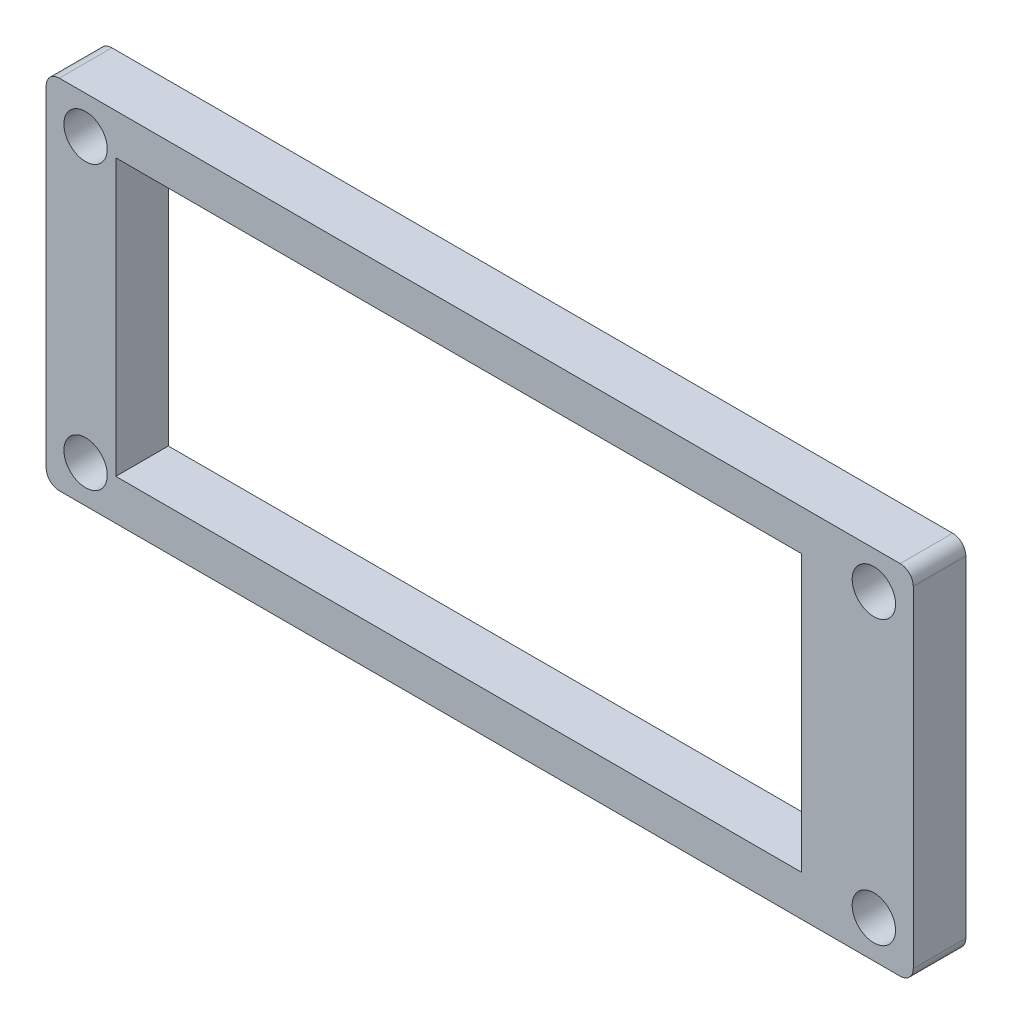
ISO-10303-21;
HEADER;
FILE_DESCRIPTION(('STEP AP214'),'2;1');
FILE_NAME('part.step','',(''),(''),'','','');
FILE_SCHEMA(('AUTOMOTIVE_DESIGN { 1 0 10303 214 1 1 1 1 }'));
ENDSEC;
DATA;
#1=APPLICATION_CONTEXT('core data for automotive mechanical design processes');
#2=APPLICATION_PROTOCOL_DEFINITION('international standard','automotive_design',2000,#1);
#3=PRODUCT_CONTEXT('',#1,'mechanical');
#4=PRODUCT('Part','Part','',(#3));
#5=PRODUCT_RELATED_PRODUCT_CATEGORY('part','',(#4));
#6=PRODUCT_DEFINITION_FORMATION('','',#4);
#7=PRODUCT_DEFINITION_CONTEXT('part definition',#1,'design');
#8=PRODUCT_DEFINITION('design','',#6,#7);
#9=PRODUCT_DEFINITION_SHAPE('','',#8);
#10=(LENGTH_UNIT() NAMED_UNIT(*) SI_UNIT(.MILLI.,.METRE.));
#11=(NAMED_UNIT(*) PLANE_ANGLE_UNIT() SI_UNIT($,.RADIAN.));
#12=(NAMED_UNIT(*) SI_UNIT($,.STERADIAN.) SOLID_ANGLE_UNIT());
#13=UNCERTAINTY_MEASURE_WITH_UNIT(LENGTH_MEASURE(1.E-05),#10,'distance_accuracy_value','');
#14=(GEOMETRIC_REPRESENTATION_CONTEXT(3) GLOBAL_UNCERTAINTY_ASSIGNED_CONTEXT((#13)) GLOBAL_UNIT_ASSIGNED_CONTEXT((#10,
#11,#12)) REPRESENTATION_CONTEXT('',''));
#15=CARTESIAN_POINT('',(0.,0.,0.));
#16=DIRECTION('',(0.,0.,1.));
#17=DIRECTION('',(1.,0.,0.));
#18=AXIS2_PLACEMENT_3D('',#15,#16,#17);
#19=CARTESIAN_POINT('',(34.6,0.,79.3851525178731));
#20=DIRECTION('',(1.,0.,0.));
#21=DIRECTION('',(0.,0.,-1.));
#22=AXIS2_PLACEMENT_3D('',#19,#20,#21);
#23=PLANE('',#22);
#24=DIRECTION('',(0.,0.,-1.));
#25=VECTOR('',#24,1.);
#26=CARTESIAN_POINT('',(34.6,12.6,79.3851525178731));
#27=LINE('',#26,#25);
#28=CARTESIAN_POINT('',(34.6,12.6,4.));
#29=VERTEX_POINT('',#28);
#30=CARTESIAN_POINT('',(34.6,12.6,0.));
#31=VERTEX_POINT('',#30);
#32=EDGE_CURVE('E279',#29,#31,#27,.T.);
#33=ORIENTED_EDGE('',*,*,#32,.F.);
#34=DIRECTION('',(0.,-1.,0.));
#35=VECTOR('',#34,1.);
#36=CARTESIAN_POINT('',(34.6,0.,4.));
#37=LINE('',#36,#35);
#38=CARTESIAN_POINT('',(34.6,-12.6,4.));
#39=VERTEX_POINT('',#38);
#40=EDGE_CURVE('E188',#29,#39,#37,.T.);
#41=ORIENTED_EDGE('',*,*,#40,.T.);
#42=DIRECTION('',(0.,0.,-1.));
#43=VECTOR('',#42,1.);
#44=CARTESIAN_POINT('',(34.6,-12.6,79.3851525178731));
#45=LINE('',#44,#43);
#46=CARTESIAN_POINT('',(34.6,-12.6,0.));
#47=VERTEX_POINT('',#46);
#48=EDGE_CURVE('E343',#39,#47,#45,.T.);
#49=ORIENTED_EDGE('',*,*,#48,.T.);
#50=DIRECTION('',(0.,-1.,0.));
#51=VECTOR('',#50,1.);
#52=CARTESIAN_POINT('',(34.6,0.,0.));
#53=LINE('',#52,#51);
#54=EDGE_CURVE('E258',#31,#47,#53,.T.);
#55=ORIENTED_EDGE('',*,*,#54,.F.);
#56=EDGE_LOOP('',(#33,#41,#49,#55));
#57=FACE_BOUND('',#56,.T.);
#58=ADVANCED_FACE('F41',(#57),#23,.T.);
#59=CARTESIAN_POINT('',(33.6,12.6,79.3851525178731));
#60=DIRECTION('',(0.,0.,-1.));
#61=DIRECTION('',(-1.,0.,0.));
#62=AXIS2_PLACEMENT_3D('',#59,#60,#61);
#63=CYLINDRICAL_SURFACE('',#62,1.);
#64=CARTESIAN_POINT('',(33.6,12.6,4.));
#65=DIRECTION('',(0.,0.,1.));
#66=DIRECTION('',(1.,0.,0.));
#67=AXIS2_PLACEMENT_3D('',#64,#65,#66);
#68=CIRCLE('',#67,1.);
#69=CARTESIAN_POINT('',(33.6,13.6,4.));
#70=VERTEX_POINT('',#69);
#71=EDGE_CURVE('E274',#29,#70,#68,.T.);
#72=ORIENTED_EDGE('',*,*,#71,.F.);
#73=ORIENTED_EDGE('',*,*,#32,.T.);
#74=CARTESIAN_POINT('',(33.6,12.6,0.));
#75=DIRECTION('',(0.,0.,1.));
#76=DIRECTION('',(1.,0.,0.));
#77=AXIS2_PLACEMENT_3D('',#74,#75,#76);
#78=CIRCLE('',#77,1.);
#79=CARTESIAN_POINT('',(33.6,13.6,0.));
#80=VERTEX_POINT('',#79);
#81=EDGE_CURVE('E275',#31,#80,#78,.T.);
#82=ORIENTED_EDGE('',*,*,#81,.T.);
#83=DIRECTION('',(0.,0.,-1.));
#84=VECTOR('',#83,1.);
#85=CARTESIAN_POINT('',(33.6,13.6,79.3851525178731));
#86=LINE('',#85,#84);
#87=EDGE_CURVE('E338',#70,#80,#86,.T.);
#88=ORIENTED_EDGE('',*,*,#87,.F.);
#89=EDGE_LOOP('',(#72,#73,#82,#88));
#90=FACE_BOUND('',#89,.T.);
#91=ADVANCED_FACE('F387',(#90),#63,.T.);
#92=CARTESIAN_POINT('',(0.,13.6,79.3851525178731));
#93=DIRECTION('',(0.,1.,0.));
#94=DIRECTION('',(0.,0.,1.));
#95=AXIS2_PLACEMENT_3D('',#92,#93,#94);
#96=PLANE('',#95);
#97=DIRECTION('',(0.,0.,-1.));
#98=VECTOR('',#97,1.);
#99=CARTESIAN_POINT('',(-30.4,13.6,79.3851525178731));
#100=LINE('',#99,#98);
#101=CARTESIAN_POINT('',(-30.4,13.6,4.));
#102=VERTEX_POINT('',#101);
#103=CARTESIAN_POINT('',(-30.4,13.6,0.));
#104=VERTEX_POINT('',#103);
#105=EDGE_CURVE('E271',#102,#104,#100,.T.);
#106=ORIENTED_EDGE('',*,*,#105,.F.);
#107=DIRECTION('',(1.,0.,0.));
#108=VECTOR('',#107,1.);
#109=CARTESIAN_POINT('',(0.,13.6,4.));
#110=LINE('',#109,#108);
#111=EDGE_CURVE('E278',#102,#70,#110,.T.);
#112=ORIENTED_EDGE('',*,*,#111,.T.);
#113=ORIENTED_EDGE('',*,*,#87,.T.);
#114=DIRECTION('',(1.,0.,0.));
#115=VECTOR('',#114,1.);
#116=CARTESIAN_POINT('',(0.,13.6,0.));
#117=LINE('',#116,#115);
#118=EDGE_CURVE('E266',#104,#80,#117,.T.);
#119=ORIENTED_EDGE('',*,*,#118,.F.);
#120=EDGE_LOOP('',(#106,#112,#113,#119));
#121=FACE_BOUND('',#120,.T.);
#122=ADVANCED_FACE('F392',(#121),#96,.T.);
#123=CARTESIAN_POINT('',(-30.4,12.6,79.3851525178731));
#124=DIRECTION('',(0.,0.,-1.));
#125=DIRECTION('',(-1.,0.,0.));
#126=AXIS2_PLACEMENT_3D('',#123,#124,#125);
#127=CYLINDRICAL_SURFACE('',#126,0.999999999999998);
#128=CARTESIAN_POINT('',(-30.4,12.6,4.));
#129=DIRECTION('',(0.,0.,1.));
#130=DIRECTION('',(1.,0.,0.));
#131=AXIS2_PLACEMENT_3D('',#128,#129,#130);
#132=CIRCLE('',#131,0.999999999999998);
#133=CARTESIAN_POINT('',(-31.4,12.6,4.));
#134=VERTEX_POINT('',#133);
#135=EDGE_CURVE('E332',#102,#134,#132,.T.);
#136=ORIENTED_EDGE('',*,*,#135,.F.);
#137=ORIENTED_EDGE('',*,*,#105,.T.);
#138=CARTESIAN_POINT('',(-30.4,12.6,0.));
#139=DIRECTION('',(0.,0.,1.));
#140=DIRECTION('',(1.,0.,0.));
#141=AXIS2_PLACEMENT_3D('',#138,#139,#140);
#142=CIRCLE('',#141,0.999999999999998);
#143=CARTESIAN_POINT('',(-31.4,12.6,0.));
#144=VERTEX_POINT('',#143);
#145=EDGE_CURVE('E267',#104,#144,#142,.T.);
#146=ORIENTED_EDGE('',*,*,#145,.T.);
#147=DIRECTION('',(0.,0.,-1.));
#148=VECTOR('',#147,1.);
#149=CARTESIAN_POINT('',(-31.4,12.6,79.3851525178731));
#150=LINE('',#149,#148);
#151=EDGE_CURVE('E334',#134,#144,#150,.T.);
#152=ORIENTED_EDGE('',*,*,#151,.F.);
#153=EDGE_LOOP('',(#136,#137,#146,#152));
#154=FACE_BOUND('',#153,.T.);
#155=ADVANCED_FACE('F399',(#154),#127,.T.);
#156=CARTESIAN_POINT('',(-31.4,0.,79.3851525178731));
#157=DIRECTION('',(-1.,0.,0.));
#158=DIRECTION('',(0.,0.,1.));
#159=AXIS2_PLACEMENT_3D('',#156,#157,#158);
#160=PLANE('',#159);
#161=DIRECTION('',(0.,0.,-1.));
#162=VECTOR('',#161,1.);
#163=CARTESIAN_POINT('',(-31.4,-12.6,79.3851525178731));
#164=LINE('',#163,#162);
#165=CARTESIAN_POINT('',(-31.4,-12.6,4.));
#166=VERTEX_POINT('',#165);
#167=CARTESIAN_POINT('',(-31.4,-12.6,0.));
#168=VERTEX_POINT('',#167);
#169=EDGE_CURVE('E263',#166,#168,#164,.T.);
#170=ORIENTED_EDGE('',*,*,#169,.F.);
#171=DIRECTION('',(0.,1.,0.));
#172=VECTOR('',#171,1.);
#173=CARTESIAN_POINT('',(-31.4,0.,4.));
#174=LINE('',#173,#172);
#175=EDGE_CURVE('E270',#166,#134,#174,.T.);
#176=ORIENTED_EDGE('',*,*,#175,.T.);
#177=ORIENTED_EDGE('',*,*,#151,.T.);
#178=DIRECTION('',(0.,1.,0.));
#179=VECTOR('',#178,1.);
#180=CARTESIAN_POINT('',(-31.4,0.,0.));
#181=LINE('',#180,#179);
#182=EDGE_CURVE('E257',#168,#144,#181,.T.);
#183=ORIENTED_EDGE('',*,*,#182,.F.);
#184=EDGE_LOOP('',(#170,#176,#177,#183));
#185=FACE_BOUND('',#184,.T.);
#186=ADVANCED_FACE('F403',(#185),#160,.T.);
#187=CARTESIAN_POINT('',(-30.4,-12.6,79.3851525178731));
#188=DIRECTION('',(0.,0.,-1.));
#189=DIRECTION('',(-1.,0.,0.));
#190=AXIS2_PLACEMENT_3D('',#187,#188,#189);
#191=CYLINDRICAL_SURFACE('',#190,0.999999999999998);
#192=CARTESIAN_POINT('',(-30.4,-12.6,4.));
#193=DIRECTION('',(0.,0.,1.));
#194=DIRECTION('',(1.,0.,0.));
#195=AXIS2_PLACEMENT_3D('',#192,#193,#194);
#196=CIRCLE('',#195,0.999999999999998);
#197=CARTESIAN_POINT('',(-30.4,-13.6,4.));
#198=VERTEX_POINT('',#197);
#199=EDGE_CURVE('E328',#166,#198,#196,.T.);
#200=ORIENTED_EDGE('',*,*,#199,.F.);
#201=ORIENTED_EDGE('',*,*,#169,.T.);
#202=CARTESIAN_POINT('',(-30.4,-12.6,0.));
#203=DIRECTION('',(0.,0.,1.));
#204=DIRECTION('',(1.,0.,0.));
#205=AXIS2_PLACEMENT_3D('',#202,#203,#204);
#206=CIRCLE('',#205,0.999999999999998);
#207=CARTESIAN_POINT('',(-30.4,-13.6,0.));
#208=VERTEX_POINT('',#207);
#209=EDGE_CURVE('E259',#168,#208,#206,.T.);
#210=ORIENTED_EDGE('',*,*,#209,.T.);
#211=DIRECTION('',(0.,0.,-1.));
#212=VECTOR('',#211,1.);
#213=CARTESIAN_POINT('',(-30.4,-13.6,79.3851525178731));
#214=LINE('',#213,#212);
#215=EDGE_CURVE('E327',#198,#208,#214,.T.);
#216=ORIENTED_EDGE('',*,*,#215,.F.);
#217=EDGE_LOOP('',(#200,#201,#210,#216));
#218=FACE_BOUND('',#217,.T.);
#219=ADVANCED_FACE('F407',(#218),#191,.T.);
#220=CARTESIAN_POINT('',(0.,-13.6,79.3851525178731));
#221=DIRECTION('',(0.,-1.,0.));
#222=DIRECTION('',(0.,0.,-1.));
#223=AXIS2_PLACEMENT_3D('',#220,#221,#222);
#224=PLANE('',#223);
#225=DIRECTION('',(0.,0.,-1.));
#226=VECTOR('',#225,1.);
#227=CARTESIAN_POINT('',(33.6,-13.6,79.3851525178731));
#228=LINE('',#227,#226);
#229=CARTESIAN_POINT('',(33.6,-13.6,4.));
#230=VERTEX_POINT('',#229);
#231=CARTESIAN_POINT('',(33.6,-13.6,0.));
#232=VERTEX_POINT('',#231);
#233=EDGE_CURVE('E253',#230,#232,#228,.T.);
#234=ORIENTED_EDGE('',*,*,#233,.F.);
#235=DIRECTION('',(-1.,0.,0.));
#236=VECTOR('',#235,1.);
#237=CARTESIAN_POINT('',(0.,-13.6,4.));
#238=LINE('',#237,#236);
#239=EDGE_CURVE('E262',#230,#198,#238,.T.);
#240=ORIENTED_EDGE('',*,*,#239,.T.);
#241=ORIENTED_EDGE('',*,*,#215,.T.);
#242=DIRECTION('',(-1.,0.,0.));
#243=VECTOR('',#242,1.);
#244=CARTESIAN_POINT('',(0.,-13.6,0.));
#245=LINE('',#244,#243);
#246=EDGE_CURVE('E254',#232,#208,#245,.T.);
#247=ORIENTED_EDGE('',*,*,#246,.F.);
#248=EDGE_LOOP('',(#234,#240,#241,#247));
#249=FACE_BOUND('',#248,.T.);
#250=ADVANCED_FACE('F384',(#249),#224,.T.);
#251=CARTESIAN_POINT('',(0.,10.5,79.3851525178731));
#252=DIRECTION('',(0.,1.,0.));
#253=DIRECTION('',(0.,0.,1.));
#254=AXIS2_PLACEMENT_3D('',#251,#252,#253);
#255=PLANE('',#254);
#256=DIRECTION('',(1.,0.,0.));
#257=VECTOR('',#256,1.);
#258=CARTESIAN_POINT('',(0.,10.5,4.));
#259=LINE('',#258,#257);
#260=CARTESIAN_POINT('',(-26.1,10.5,4.));
#261=VERTEX_POINT('',#260);
#262=CARTESIAN_POINT('',(26.1,10.5,4.));
#263=VERTEX_POINT('',#262);
#264=EDGE_CURVE('E322',#261,#263,#259,.T.);
#265=ORIENTED_EDGE('',*,*,#264,.F.);
#266=DIRECTION('',(0.,0.,-1.));
#267=VECTOR('',#266,1.);
#268=CARTESIAN_POINT('',(-26.1,10.5,79.3851525178731));
#269=LINE('',#268,#267);
#270=CARTESIAN_POINT('',(-26.1,10.5,0.));
#271=VERTEX_POINT('',#270);
#272=EDGE_CURVE('E45',#261,#271,#269,.T.);
#273=ORIENTED_EDGE('',*,*,#272,.T.);
#274=DIRECTION('',(1.,0.,0.));
#275=VECTOR('',#274,1.);
#276=CARTESIAN_POINT('',(0.,10.5,0.));
#277=LINE('',#276,#275);
#278=CARTESIAN_POINT('',(26.1,10.5,0.));
#279=VERTEX_POINT('',#278);
#280=EDGE_CURVE('E296',#271,#279,#277,.T.);
#281=ORIENTED_EDGE('',*,*,#280,.T.);
#282=DIRECTION('',(0.,0.,-1.));
#283=VECTOR('',#282,1.);
#284=CARTESIAN_POINT('',(26.1,10.5,79.3851525178731));
#285=LINE('',#284,#283);
#286=EDGE_CURVE('E295',#263,#279,#285,.T.);
#287=ORIENTED_EDGE('',*,*,#286,.F.);
#288=EDGE_LOOP('',(#265,#273,#281,#287));
#289=FACE_BOUND('',#288,.T.);
#290=ADVANCED_FACE('F373',(#289),#255,.F.);
#291=CARTESIAN_POINT('',(26.1,0.,79.3851525178731));
#292=DIRECTION('',(1.,0.,0.));
#293=DIRECTION('',(0.,0.,-1.));
#294=AXIS2_PLACEMENT_3D('',#291,#292,#293);
#295=PLANE('',#294);
#296=DIRECTION('',(0.,-1.,0.));
#297=VECTOR('',#296,1.);
#298=CARTESIAN_POINT('',(26.1,0.,4.));
#299=LINE('',#298,#297);
#300=CARTESIAN_POINT('',(26.1,-10.5,4.));
#301=VERTEX_POINT('',#300);
#302=EDGE_CURVE('E50',#263,#301,#299,.T.);
#303=ORIENTED_EDGE('',*,*,#302,.F.);
#304=ORIENTED_EDGE('',*,*,#286,.T.);
#305=DIRECTION('',(0.,-1.,0.));
#306=VECTOR('',#305,1.);
#307=CARTESIAN_POINT('',(26.1,0.,0.));
#308=LINE('',#307,#306);
#309=CARTESIAN_POINT('',(26.1,-10.5,0.));
#310=VERTEX_POINT('',#309);
#311=EDGE_CURVE('E292',#279,#310,#308,.T.);
#312=ORIENTED_EDGE('',*,*,#311,.T.);
#313=DIRECTION('',(0.,0.,-1.));
#314=VECTOR('',#313,1.);
#315=CARTESIAN_POINT('',(26.1,-10.5,79.3851525178731));
#316=LINE('',#315,#314);
#317=EDGE_CURVE('E291',#301,#310,#316,.T.);
#318=ORIENTED_EDGE('',*,*,#317,.F.);
#319=EDGE_LOOP('',(#303,#304,#312,#318));
#320=FACE_BOUND('',#319,.T.);
#321=ADVANCED_FACE('F376',(#320),#295,.F.);
#322=CARTESIAN_POINT('',(0.,-10.5,79.3851525178731));
#323=DIRECTION('',(0.,-1.,0.));
#324=DIRECTION('',(0.,0.,-1.));
#325=AXIS2_PLACEMENT_3D('',#322,#323,#324);
#326=PLANE('',#325);
#327=DIRECTION('',(-1.,0.,0.));
#328=VECTOR('',#327,1.);
#329=CARTESIAN_POINT('',(0.,-10.5,4.));
#330=LINE('',#329,#328);
#331=CARTESIAN_POINT('',(-26.1,-10.5,4.));
#332=VERTEX_POINT('',#331);
#333=EDGE_CURVE('E11',#301,#332,#330,.T.);
#334=ORIENTED_EDGE('',*,*,#333,.F.);
#335=ORIENTED_EDGE('',*,*,#317,.T.);
#336=DIRECTION('',(-1.,0.,0.));
#337=VECTOR('',#336,1.);
#338=CARTESIAN_POINT('',(0.,-10.5,0.));
#339=LINE('',#338,#337);
#340=CARTESIAN_POINT('',(-26.1,-10.5,0.));
#341=VERTEX_POINT('',#340);
#342=EDGE_CURVE('E288',#310,#341,#339,.T.);
#343=ORIENTED_EDGE('',*,*,#342,.T.);
#344=DIRECTION('',(0.,0.,-1.));
#345=VECTOR('',#344,1.);
#346=CARTESIAN_POINT('',(-26.1,-10.5,79.3851525178731));
#347=LINE('',#346,#345);
#348=EDGE_CURVE('E287',#332,#341,#347,.T.);
#349=ORIENTED_EDGE('',*,*,#348,.F.);
#350=EDGE_LOOP('',(#334,#335,#343,#349));
#351=FACE_BOUND('',#350,.T.);
#352=ADVANCED_FACE('F364',(#351),#326,.F.);
#353=CARTESIAN_POINT('',(-26.1,0.,79.3851525178731));
#354=DIRECTION('',(-1.,0.,0.));
#355=DIRECTION('',(0.,0.,1.));
#356=AXIS2_PLACEMENT_3D('',#353,#354,#355);
#357=PLANE('',#356);
#358=DIRECTION('',(0.,1.,0.));
#359=VECTOR('',#358,1.);
#360=CARTESIAN_POINT('',(-26.1,0.,4.));
#361=LINE('',#360,#359);
#362=EDGE_CURVE('E325',#332,#261,#361,.T.);
#363=ORIENTED_EDGE('',*,*,#362,.F.);
#364=ORIENTED_EDGE('',*,*,#348,.T.);
#365=DIRECTION('',(0.,1.,0.));
#366=VECTOR('',#365,1.);
#367=CARTESIAN_POINT('',(-26.1,0.,0.));
#368=LINE('',#367,#366);
#369=EDGE_CURVE('E283',#341,#271,#368,.T.);
#370=ORIENTED_EDGE('',*,*,#369,.T.);
#371=ORIENTED_EDGE('',*,*,#272,.F.);
#372=EDGE_LOOP('',(#363,#364,#370,#371));
#373=FACE_BOUND('',#372,.T.);
#374=ADVANCED_FACE('F359',(#373),#357,.F.);
#375=CARTESIAN_POINT('',(31.6,10.75,79.3851525178731));
#376=DIRECTION('',(0.,0.,-1.));
#377=DIRECTION('',(-1.,0.,0.));
#378=AXIS2_PLACEMENT_3D('',#375,#376,#377);
#379=CYLINDRICAL_SURFACE('',#378,1.6499999999847);
#380=CARTESIAN_POINT('',(31.6,10.75,0.));
#381=DIRECTION('',(0.,0.,1.));
#382=DIRECTION('',(1.,0.,0.));
#383=AXIS2_PLACEMENT_3D('',#380,#381,#382);
#384=CIRCLE('',#383,1.6499999999847);
#385=CARTESIAN_POINT('',(33.2499999999847,10.75,0.));
#386=VERTEX_POINT('',#385);
#387=EDGE_CURVE('E282',#386,#386,#384,.T.);
#388=ORIENTED_EDGE('',*,*,#387,.F.);
#389=EDGE_LOOP('',(#388));
#390=FACE_BOUND('',#389,.T.);
#391=CARTESIAN_POINT('',(31.6,10.75,4.));
#392=DIRECTION('',(0.,0.,1.));
#393=DIRECTION('',(1.,0.,0.));
#394=AXIS2_PLACEMENT_3D('',#391,#392,#393);
#395=CIRCLE('',#394,1.6499999999847);
#396=CARTESIAN_POINT('',(33.2499999999847,10.75,4.));
#397=VERTEX_POINT('',#396);
#398=EDGE_CURVE('E286',#397,#397,#395,.T.);
#399=ORIENTED_EDGE('',*,*,#398,.T.);
#400=EDGE_LOOP('',(#399));
#401=FACE_BOUND('',#400,.T.);
#402=ADVANCED_FACE('F430',(#390,#401),#379,.F.);
#403=CARTESIAN_POINT('',(31.6,-10.75,79.3851525178731));
#404=DIRECTION('',(0.,0.,-1.));
#405=DIRECTION('',(-1.,0.,0.));
#406=AXIS2_PLACEMENT_3D('',#403,#404,#405);
#407=CYLINDRICAL_SURFACE('',#406,1.6499999999847);
#408=CARTESIAN_POINT('',(31.6,-10.75,0.));
#409=DIRECTION('',(0.,0.,1.));
#410=DIRECTION('',(1.,0.,0.));
#411=AXIS2_PLACEMENT_3D('',#408,#409,#410);
#412=CIRCLE('',#411,1.6499999999847);
#413=CARTESIAN_POINT('',(33.2499999999847,-10.75,0.));
#414=VERTEX_POINT('',#413);
#415=EDGE_CURVE('E301',#414,#414,#412,.T.);
#416=ORIENTED_EDGE('',*,*,#415,.F.);
#417=EDGE_LOOP('',(#416));
#418=FACE_BOUND('',#417,.T.);
#419=CARTESIAN_POINT('',(31.6,-10.75,4.));
#420=DIRECTION('',(0.,0.,1.));
#421=DIRECTION('',(1.,0.,0.));
#422=AXIS2_PLACEMENT_3D('',#419,#420,#421);
#423=CIRCLE('',#422,1.6499999999847);
#424=CARTESIAN_POINT('',(33.2499999999847,-10.75,4.));
#425=VERTEX_POINT('',#424);
#426=EDGE_CURVE('E315',#425,#425,#423,.T.);
#427=ORIENTED_EDGE('',*,*,#426,.T.);
#428=EDGE_LOOP('',(#427));
#429=FACE_BOUND('',#428,.T.);
#430=ADVANCED_FACE('F426',(#418,#429),#407,.F.);
#431=CARTESIAN_POINT('',(-28.4,-10.75,79.3851525178731));
#432=DIRECTION('',(0.,0.,-1.));
#433=DIRECTION('',(-1.,0.,0.));
#434=AXIS2_PLACEMENT_3D('',#431,#432,#433);
#435=CYLINDRICAL_SURFACE('',#434,1.6499999999847);
#436=CARTESIAN_POINT('',(-28.4,-10.75,0.));
#437=DIRECTION('',(0.,0.,1.));
#438=DIRECTION('',(1.,0.,0.));
#439=AXIS2_PLACEMENT_3D('',#436,#437,#438);
#440=CIRCLE('',#439,1.6499999999847);
#441=CARTESIAN_POINT('',(-26.7500000000153,-10.75,0.));
#442=VERTEX_POINT('',#441);
#443=EDGE_CURVE('E304',#442,#442,#440,.T.);
#444=ORIENTED_EDGE('',*,*,#443,.F.);
#445=EDGE_LOOP('',(#444));
#446=FACE_BOUND('',#445,.T.);
#447=CARTESIAN_POINT('',(-28.4,-10.75,4.));
#448=DIRECTION('',(0.,0.,1.));
#449=DIRECTION('',(1.,0.,0.));
#450=AXIS2_PLACEMENT_3D('',#447,#448,#449);
#451=CIRCLE('',#450,1.6499999999847);
#452=CARTESIAN_POINT('',(-26.7500000000153,-10.75,4.));
#453=VERTEX_POINT('',#452);
#454=EDGE_CURVE('E312',#453,#453,#451,.T.);
#455=ORIENTED_EDGE('',*,*,#454,.T.);
#456=EDGE_LOOP('',(#455));
#457=FACE_BOUND('',#456,.T.);
#458=ADVANCED_FACE('F422',(#446,#457),#435,.F.);
#459=CARTESIAN_POINT('',(-28.4,10.75,79.3851525178731));
#460=DIRECTION('',(0.,0.,-1.));
#461=DIRECTION('',(-1.,0.,0.));
#462=AXIS2_PLACEMENT_3D('',#459,#460,#461);
#463=CYLINDRICAL_SURFACE('',#462,1.6499999999847);
#464=CARTESIAN_POINT('',(-28.4,10.75,0.));
#465=DIRECTION('',(0.,0.,1.));
#466=DIRECTION('',(1.,0.,0.));
#467=AXIS2_PLACEMENT_3D('',#464,#465,#466);
#468=CIRCLE('',#467,1.6499999999847);
#469=CARTESIAN_POINT('',(-26.7500000000153,10.75,0.));
#470=VERTEX_POINT('',#469);
#471=EDGE_CURVE('E252',#470,#470,#468,.T.);
#472=ORIENTED_EDGE('',*,*,#471,.F.);
#473=EDGE_LOOP('',(#472));
#474=FACE_BOUND('',#473,.T.);
#475=CARTESIAN_POINT('',(-28.4,10.75,4.));
#476=DIRECTION('',(0.,0.,1.));
#477=DIRECTION('',(1.,0.,0.));
#478=AXIS2_PLACEMENT_3D('',#475,#476,#477);
#479=CIRCLE('',#478,1.6499999999847);
#480=CARTESIAN_POINT('',(-26.7500000000153,10.75,4.));
#481=VERTEX_POINT('',#480);
#482=EDGE_CURVE('E309',#481,#481,#479,.T.);
#483=ORIENTED_EDGE('',*,*,#482,.T.);
#484=EDGE_LOOP('',(#483));
#485=FACE_BOUND('',#484,.T.);
#486=ADVANCED_FACE('F418',(#474,#485),#463,.F.);
#487=CARTESIAN_POINT('',(33.6,-12.6,79.3851525178731));
#488=DIRECTION('',(0.,0.,-1.));
#489=DIRECTION('',(-1.,0.,0.));
#490=AXIS2_PLACEMENT_3D('',#487,#488,#489);
#491=CYLINDRICAL_SURFACE('',#490,1.);
#492=CARTESIAN_POINT('',(33.6,-12.6,4.));
#493=DIRECTION('',(0.,0.,1.));
#494=DIRECTION('',(1.,0.,0.));
#495=AXIS2_PLACEMENT_3D('',#492,#493,#494);
#496=CIRCLE('',#495,1.);
#497=EDGE_CURVE('E331',#230,#39,#496,.T.);
#498=ORIENTED_EDGE('',*,*,#497,.F.);
#499=ORIENTED_EDGE('',*,*,#233,.T.);
#500=CARTESIAN_POINT('',(33.6,-12.6,0.));
#501=DIRECTION('',(0.,0.,1.));
#502=DIRECTION('',(1.,0.,0.));
#503=AXIS2_PLACEMENT_3D('',#500,#501,#502);
#504=CIRCLE('',#503,1.);
#505=EDGE_CURVE('E249',#232,#47,#504,.T.);
#506=ORIENTED_EDGE('',*,*,#505,.T.);
#507=ORIENTED_EDGE('',*,*,#48,.F.);
#508=EDGE_LOOP('',(#498,#499,#506,#507));
#509=FACE_BOUND('',#508,.T.);
#510=ADVANCED_FACE('F415',(#509),#491,.T.);
#511=CARTESIAN_POINT('',(0.,0.,0.));
#512=DIRECTION('',(0.,0.,1.));
#513=DIRECTION('',(1.,0.,0.));
#514=AXIS2_PLACEMENT_3D('',#511,#512,#513);
#515=PLANE('',#514);
#516=DIRECTION('',(1.,0.,0.));
#517=VECTOR('',#516,1.);
#518=CARTESIAN_POINT('',(0.,4.67,0.));
#519=LINE('',#518,#517);
#520=CARTESIAN_POINT('',(-29.77,4.67,0.));
#521=VERTEX_POINT('',#520);
#522=CARTESIAN_POINT('',(-27.03,4.67,0.));
#523=VERTEX_POINT('',#522);
#524=EDGE_CURVE('E198',#521,#523,#519,.T.);
#525=ORIENTED_EDGE('',*,*,#524,.F.);
#526=DIRECTION('',(0.,1.,0.));
#527=VECTOR('',#526,1.);
#528=CARTESIAN_POINT('',(-29.77,0.,0.));
#529=LINE('',#528,#527);
#530=CARTESIAN_POINT('',(-29.77,-5.69,0.));
#531=VERTEX_POINT('',#530);
#532=EDGE_CURVE('E58',#531,#521,#529,.T.);
#533=ORIENTED_EDGE('',*,*,#532,.F.);
#534=DIRECTION('',(-1.,0.,0.));
#535=VECTOR('',#534,1.);
#536=CARTESIAN_POINT('',(0.,-5.69,0.));
#537=LINE('',#536,#535);
#538=CARTESIAN_POINT('',(-27.03,-5.69,0.));
#539=VERTEX_POINT('',#538);
#540=EDGE_CURVE('E187',#539,#531,#537,.T.);
#541=ORIENTED_EDGE('',*,*,#540,.F.);
#542=DIRECTION('',(0.,-1.,0.));
#543=VECTOR('',#542,1.);
#544=CARTESIAN_POINT('',(-27.03,0.,0.));
#545=LINE('',#544,#543);
#546=EDGE_CURVE('E210',#523,#539,#545,.T.);
#547=ORIENTED_EDGE('',*,*,#546,.F.);
#548=EDGE_LOOP('',(#525,#533,#541,#547));
#549=FACE_BOUND('',#548,.T.);
#550=DIRECTION('',(0.,-1.,0.));
#551=VECTOR('',#550,1.);
#552=CARTESIAN_POINT('',(29.77,4.67,0.));
#553=LINE('',#552,#551);
#554=CARTESIAN_POINT('',(29.77,4.67,0.));
#555=VERTEX_POINT('',#554);
#556=CARTESIAN_POINT('',(29.77,-5.69,0.));
#557=VERTEX_POINT('',#556);
#558=EDGE_CURVE('E235',#555,#557,#553,.T.);
#559=ORIENTED_EDGE('',*,*,#558,.F.);
#560=DIRECTION('',(1.,0.,0.));
#561=VECTOR('',#560,1.);
#562=CARTESIAN_POINT('',(27.03,4.67,0.));
#563=LINE('',#562,#561);
#564=CARTESIAN_POINT('',(27.03,4.67,0.));
#565=VERTEX_POINT('',#564);
#566=EDGE_CURVE('E66',#565,#555,#563,.T.);
#567=ORIENTED_EDGE('',*,*,#566,.F.);
#568=DIRECTION('',(0.,1.,0.));
#569=VECTOR('',#568,1.);
#570=CARTESIAN_POINT('',(27.03,-5.69,0.));
#571=LINE('',#570,#569);
#572=CARTESIAN_POINT('',(27.03,-5.69,0.));
#573=VERTEX_POINT('',#572);
#574=EDGE_CURVE('E228',#573,#565,#571,.T.);
#575=ORIENTED_EDGE('',*,*,#574,.F.);
#576=DIRECTION('',(-1.,0.,0.));
#577=VECTOR('',#576,1.);
#578=CARTESIAN_POINT('',(29.77,-5.69,0.));
#579=LINE('',#578,#577);
#580=EDGE_CURVE('E231',#557,#573,#579,.T.);
#581=ORIENTED_EDGE('',*,*,#580,.F.);
#582=EDGE_LOOP('',(#559,#567,#575,#581));
#583=FACE_BOUND('',#582,.T.);
#584=ORIENTED_EDGE('',*,*,#471,.T.);
#585=EDGE_LOOP('',(#584));
#586=FACE_BOUND('',#585,.T.);
#587=ORIENTED_EDGE('',*,*,#443,.T.);
#588=EDGE_LOOP('',(#587));
#589=FACE_BOUND('',#588,.T.);
#590=ORIENTED_EDGE('',*,*,#415,.T.);
#591=EDGE_LOOP('',(#590));
#592=FACE_BOUND('',#591,.T.);
#593=ORIENTED_EDGE('',*,*,#387,.T.);
#594=EDGE_LOOP('',(#593));
#595=FACE_BOUND('',#594,.T.);
#596=ORIENTED_EDGE('',*,*,#280,.F.);
#597=ORIENTED_EDGE('',*,*,#369,.F.);
#598=ORIENTED_EDGE('',*,*,#342,.F.);
#599=ORIENTED_EDGE('',*,*,#311,.F.);
#600=EDGE_LOOP('',(#596,#597,#598,#599));
#601=FACE_BOUND('',#600,.T.);
#602=ORIENTED_EDGE('',*,*,#54,.T.);
#603=ORIENTED_EDGE('',*,*,#505,.F.);
#604=ORIENTED_EDGE('',*,*,#246,.T.);
#605=ORIENTED_EDGE('',*,*,#209,.F.);
#606=ORIENTED_EDGE('',*,*,#182,.T.);
#607=ORIENTED_EDGE('',*,*,#145,.F.);
#608=ORIENTED_EDGE('',*,*,#118,.T.);
#609=ORIENTED_EDGE('',*,*,#81,.F.);
#610=EDGE_LOOP('',(#602,#603,#604,#605,#606,#607,#608,#609));
#611=FACE_BOUND('',#610,.T.);
#612=ADVANCED_FACE('F368',(#549,#583,#586,#589,#592,#595,#601,#611),#515,.F.);
#613=CARTESIAN_POINT('',(0.,0.,4.00000000000001));
#614=DIRECTION('',(0.,0.,1.));
#615=DIRECTION('',(1.,0.,0.));
#616=AXIS2_PLACEMENT_3D('',#613,#614,#615);
#617=PLANE('',#616);
#618=ORIENTED_EDGE('',*,*,#398,.F.);
#619=EDGE_LOOP('',(#618));
#620=FACE_BOUND('',#619,.T.);
#621=ORIENTED_EDGE('',*,*,#426,.F.);
#622=EDGE_LOOP('',(#621));
#623=FACE_BOUND('',#622,.T.);
#624=ORIENTED_EDGE('',*,*,#454,.F.);
#625=EDGE_LOOP('',(#624));
#626=FACE_BOUND('',#625,.T.);
#627=ORIENTED_EDGE('',*,*,#482,.F.);
#628=EDGE_LOOP('',(#627));
#629=FACE_BOUND('',#628,.T.);
#630=ORIENTED_EDGE('',*,*,#40,.F.);
#631=ORIENTED_EDGE('',*,*,#71,.T.);
#632=ORIENTED_EDGE('',*,*,#111,.F.);
#633=ORIENTED_EDGE('',*,*,#135,.T.);
#634=ORIENTED_EDGE('',*,*,#175,.F.);
#635=ORIENTED_EDGE('',*,*,#199,.T.);
#636=ORIENTED_EDGE('',*,*,#239,.F.);
#637=ORIENTED_EDGE('',*,*,#497,.T.);
#638=EDGE_LOOP('',(#630,#631,#632,#633,#634,#635,#636,#637));
#639=FACE_BOUND('',#638,.T.);
#640=ORIENTED_EDGE('',*,*,#362,.T.);
#641=ORIENTED_EDGE('',*,*,#264,.T.);
#642=ORIENTED_EDGE('',*,*,#302,.T.);
#643=ORIENTED_EDGE('',*,*,#333,.T.);
#644=EDGE_LOOP('',(#640,#641,#642,#643));
#645=FACE_BOUND('',#644,.T.);
#646=ADVANCED_FACE('F43',(#620,#623,#626,#629,#639,#645),#617,.T.);
#647=CARTESIAN_POINT('',(27.03,4.67,3.));
#648=DIRECTION('',(0.,1.,0.));
#649=DIRECTION('',(0.,0.,1.));
#650=AXIS2_PLACEMENT_3D('',#647,#648,#649);
#651=PLANE('',#650);
#652=ORIENTED_EDGE('',*,*,#566,.T.);
#653=DIRECTION('',(0.,0.,-1.));
#654=VECTOR('',#653,1.);
#655=CARTESIAN_POINT('',(29.77,4.67,3.));
#656=LINE('',#655,#654);
#657=CARTESIAN_POINT('',(29.77,4.67,3.));
#658=VERTEX_POINT('',#657);
#659=EDGE_CURVE('E219',#658,#555,#656,.T.);
#660=ORIENTED_EDGE('',*,*,#659,.F.);
#661=DIRECTION('',(1.,0.,0.));
#662=VECTOR('',#661,1.);
#663=CARTESIAN_POINT('',(27.03,4.67,3.));
#664=LINE('',#663,#662);
#665=CARTESIAN_POINT('',(27.03,4.67,3.));
#666=VERTEX_POINT('',#665);
#667=EDGE_CURVE('E232',#666,#658,#664,.T.);
#668=ORIENTED_EDGE('',*,*,#667,.F.);
#669=DIRECTION('',(0.,0.,-1.));
#670=VECTOR('',#669,1.);
#671=CARTESIAN_POINT('',(27.03,4.67,3.));
#672=LINE('',#671,#670);
#673=EDGE_CURVE('E226',#666,#565,#672,.T.);
#674=ORIENTED_EDGE('',*,*,#673,.T.);
#675=EDGE_LOOP('',(#652,#660,#668,#674));
#676=FACE_BOUND('',#675,.T.);
#677=ADVANCED_FACE('F444',(#676),#651,.F.);
#678=CARTESIAN_POINT('',(27.03,-5.69,3.));
#679=DIRECTION('',(-1.,0.,0.));
#680=DIRECTION('',(0.,0.,1.));
#681=AXIS2_PLACEMENT_3D('',#678,#679,#680);
#682=PLANE('',#681);
#683=ORIENTED_EDGE('',*,*,#574,.T.);
#684=ORIENTED_EDGE('',*,*,#673,.F.);
#685=DIRECTION('',(0.,1.,0.));
#686=VECTOR('',#685,1.);
#687=CARTESIAN_POINT('',(27.03,-5.69,3.));
#688=LINE('',#687,#686);
#689=CARTESIAN_POINT('',(27.03,-5.69,3.));
#690=VERTEX_POINT('',#689);
#691=EDGE_CURVE('E221',#690,#666,#688,.T.);
#692=ORIENTED_EDGE('',*,*,#691,.F.);
#693=DIRECTION('',(0.,0.,-1.));
#694=VECTOR('',#693,1.);
#695=CARTESIAN_POINT('',(27.03,-5.69,3.));
#696=LINE('',#695,#694);
#697=EDGE_CURVE('E224',#690,#573,#696,.T.);
#698=ORIENTED_EDGE('',*,*,#697,.T.);
#699=EDGE_LOOP('',(#683,#684,#692,#698));
#700=FACE_BOUND('',#699,.T.);
#701=ADVANCED_FACE('F483',(#700),#682,.F.);
#702=CARTESIAN_POINT('',(29.77,-5.69,3.));
#703=DIRECTION('',(0.,-1.,0.));
#704=DIRECTION('',(0.,0.,-1.));
#705=AXIS2_PLACEMENT_3D('',#702,#703,#704);
#706=PLANE('',#705);
#707=ORIENTED_EDGE('',*,*,#580,.T.);
#708=ORIENTED_EDGE('',*,*,#697,.F.);
#709=DIRECTION('',(-1.,0.,0.));
#710=VECTOR('',#709,1.);
#711=CARTESIAN_POINT('',(29.77,-5.69,3.));
#712=LINE('',#711,#710);
#713=CARTESIAN_POINT('',(29.77,-5.69,3.));
#714=VERTEX_POINT('',#713);
#715=EDGE_CURVE('E241',#714,#690,#712,.T.);
#716=ORIENTED_EDGE('',*,*,#715,.F.);
#717=DIRECTION('',(0.,0.,-1.));
#718=VECTOR('',#717,1.);
#719=CARTESIAN_POINT('',(29.77,-5.69,3.));
#720=LINE('',#719,#718);
#721=EDGE_CURVE('E222',#714,#557,#720,.T.);
#722=ORIENTED_EDGE('',*,*,#721,.T.);
#723=EDGE_LOOP('',(#707,#708,#716,#722));
#724=FACE_BOUND('',#723,.T.);
#725=ADVANCED_FACE('F486',(#724),#706,.F.);
#726=CARTESIAN_POINT('',(29.77,4.67,3.));
#727=DIRECTION('',(1.,0.,0.));
#728=DIRECTION('',(0.,0.,-1.));
#729=AXIS2_PLACEMENT_3D('',#726,#727,#728);
#730=PLANE('',#729);
#731=ORIENTED_EDGE('',*,*,#558,.T.);
#732=ORIENTED_EDGE('',*,*,#721,.F.);
#733=DIRECTION('',(0.,-1.,0.));
#734=VECTOR('',#733,1.);
#735=CARTESIAN_POINT('',(29.77,4.67,3.));
#736=LINE('',#735,#734);
#737=EDGE_CURVE('E244',#658,#714,#736,.T.);
#738=ORIENTED_EDGE('',*,*,#737,.F.);
#739=ORIENTED_EDGE('',*,*,#659,.T.);
#740=EDGE_LOOP('',(#731,#732,#738,#739));
#741=FACE_BOUND('',#740,.T.);
#742=ADVANCED_FACE('F481',(#741),#730,.F.);
#743=CARTESIAN_POINT('',(0.,0.,3.));
#744=DIRECTION('',(0.,0.,-1.));
#745=DIRECTION('',(-1.,0.,0.));
#746=AXIS2_PLACEMENT_3D('',#743,#744,#745);
#747=PLANE('',#746);
#748=ORIENTED_EDGE('',*,*,#667,.T.);
#749=ORIENTED_EDGE('',*,*,#737,.T.);
#750=ORIENTED_EDGE('',*,*,#715,.T.);
#751=ORIENTED_EDGE('',*,*,#691,.T.);
#752=EDGE_LOOP('',(#748,#749,#750,#751));
#753=FACE_BOUND('',#752,.T.);
#754=ADVANCED_FACE('F478',(#753),#747,.T.);
#755=CARTESIAN_POINT('',(-29.77,0.,3.));
#756=DIRECTION('',(-1.,0.,0.));
#757=DIRECTION('',(0.,0.,1.));
#758=AXIS2_PLACEMENT_3D('',#755,#756,#757);
#759=PLANE('',#758);
#760=ORIENTED_EDGE('',*,*,#532,.T.);
#761=DIRECTION('',(0.,0.,-1.));
#762=VECTOR('',#761,1.);
#763=CARTESIAN_POINT('',(-29.77,4.67,3.));
#764=LINE('',#763,#762);
#765=CARTESIAN_POINT('',(-29.77,4.67,3.));
#766=VERTEX_POINT('',#765);
#767=EDGE_CURVE('E194',#766,#521,#764,.T.);
#768=ORIENTED_EDGE('',*,*,#767,.F.);
#769=DIRECTION('',(0.,1.,0.));
#770=VECTOR('',#769,1.);
#771=CARTESIAN_POINT('',(-29.77,0.,3.));
#772=LINE('',#771,#770);
#773=CARTESIAN_POINT('',(-29.77,-5.69,3.));
#774=VERTEX_POINT('',#773);
#775=EDGE_CURVE('E192',#774,#766,#772,.T.);
#776=ORIENTED_EDGE('',*,*,#775,.F.);
#777=DIRECTION('',(0.,0.,-1.));
#778=VECTOR('',#777,1.);
#779=CARTESIAN_POINT('',(-29.77,-5.69,3.));
#780=LINE('',#779,#778);
#781=EDGE_CURVE('E180',#774,#531,#780,.T.);
#782=ORIENTED_EDGE('',*,*,#781,.T.);
#783=EDGE_LOOP('',(#760,#768,#776,#782));
#784=FACE_BOUND('',#783,.T.);
#785=ADVANCED_FACE('F193',(#784),#759,.F.);
#786=CARTESIAN_POINT('',(0.,-5.69,3.));
#787=DIRECTION('',(0.,-1.,0.));
#788=DIRECTION('',(0.,0.,-1.));
#789=AXIS2_PLACEMENT_3D('',#786,#787,#788);
#790=PLANE('',#789);
#791=ORIENTED_EDGE('',*,*,#540,.T.);
#792=ORIENTED_EDGE('',*,*,#781,.F.);
#793=DIRECTION('',(-1.,0.,0.));
#794=VECTOR('',#793,1.);
#795=CARTESIAN_POINT('',(0.,-5.69,3.));
#796=LINE('',#795,#794);
#797=CARTESIAN_POINT('',(-27.03,-5.69,3.));
#798=VERTEX_POINT('',#797);
#799=EDGE_CURVE('E184',#798,#774,#796,.T.);
#800=ORIENTED_EDGE('',*,*,#799,.F.);
#801=DIRECTION('',(0.,0.,-1.));
#802=VECTOR('',#801,1.);
#803=CARTESIAN_POINT('',(-27.03,-5.69,3.));
#804=LINE('',#803,#802);
#805=EDGE_CURVE('E189',#798,#539,#804,.T.);
#806=ORIENTED_EDGE('',*,*,#805,.T.);
#807=EDGE_LOOP('',(#791,#792,#800,#806));
#808=FACE_BOUND('',#807,.T.);
#809=ADVANCED_FACE('F182',(#808),#790,.F.);
#810=CARTESIAN_POINT('',(-27.03,0.,3.));
#811=DIRECTION('',(1.,0.,0.));
#812=DIRECTION('',(0.,0.,-1.));
#813=AXIS2_PLACEMENT_3D('',#810,#811,#812);
#814=PLANE('',#813);
#815=ORIENTED_EDGE('',*,*,#546,.T.);
#816=ORIENTED_EDGE('',*,*,#805,.F.);
#817=DIRECTION('',(0.,-1.,0.));
#818=VECTOR('',#817,1.);
#819=CARTESIAN_POINT('',(-27.03,0.,3.));
#820=LINE('',#819,#818);
#821=CARTESIAN_POINT('',(-27.03,4.67,3.));
#822=VERTEX_POINT('',#821);
#823=EDGE_CURVE('E202',#822,#798,#820,.T.);
#824=ORIENTED_EDGE('',*,*,#823,.F.);
#825=DIRECTION('',(0.,0.,-1.));
#826=VECTOR('',#825,1.);
#827=CARTESIAN_POINT('',(-27.03,4.67,3.));
#828=LINE('',#827,#826);
#829=EDGE_CURVE('E216',#822,#523,#828,.T.);
#830=ORIENTED_EDGE('',*,*,#829,.T.);
#831=EDGE_LOOP('',(#815,#816,#824,#830));
#832=FACE_BOUND('',#831,.T.);
#833=ADVANCED_FACE('F499',(#832),#814,.F.);
#834=CARTESIAN_POINT('',(0.,4.67,3.));
#835=DIRECTION('',(0.,1.,0.));
#836=DIRECTION('',(0.,0.,1.));
#837=AXIS2_PLACEMENT_3D('',#834,#835,#836);
#838=PLANE('',#837);
#839=ORIENTED_EDGE('',*,*,#524,.T.);
#840=ORIENTED_EDGE('',*,*,#829,.F.);
#841=DIRECTION('',(1.,0.,0.));
#842=VECTOR('',#841,1.);
#843=CARTESIAN_POINT('',(0.,4.67,3.));
#844=LINE('',#843,#842);
#845=EDGE_CURVE('E204',#766,#822,#844,.T.);
#846=ORIENTED_EDGE('',*,*,#845,.F.);
#847=ORIENTED_EDGE('',*,*,#767,.T.);
#848=EDGE_LOOP('',(#839,#840,#846,#847));
#849=FACE_BOUND('',#848,.T.);
#850=ADVANCED_FACE('F502',(#849),#838,.F.);
#851=CARTESIAN_POINT('',(0.,0.,3.));
#852=DIRECTION('',(0.,0.,1.));
#853=DIRECTION('',(1.,0.,0.));
#854=AXIS2_PLACEMENT_3D('',#851,#852,#853);
#855=PLANE('',#854);
#856=ORIENTED_EDGE('',*,*,#775,.T.);
#857=ORIENTED_EDGE('',*,*,#845,.T.);
#858=ORIENTED_EDGE('',*,*,#823,.T.);
#859=ORIENTED_EDGE('',*,*,#799,.T.);
#860=EDGE_LOOP('',(#856,#857,#858,#859));
#861=FACE_BOUND('',#860,.T.);
#862=ADVANCED_FACE('F200',(#861),#855,.F.);
#863=CLOSED_SHELL('',(#58,#91,#122,#155,#186,#219,#250,#290,#321,#352,#374,#402,#430,#458,#486,
#510,#612,#646,#677,#701,#725,#742,#754,#785,#809,#833,#850,#862));
#864=MANIFOLD_SOLID_BREP('B2',#863);
#865=ADVANCED_BREP_SHAPE_REPRESENTATION('',(#18,#864),#14);
#866=SHAPE_DEFINITION_REPRESENTATION(#9,#865);
ENDSEC;
END-ISO-10303-21;
